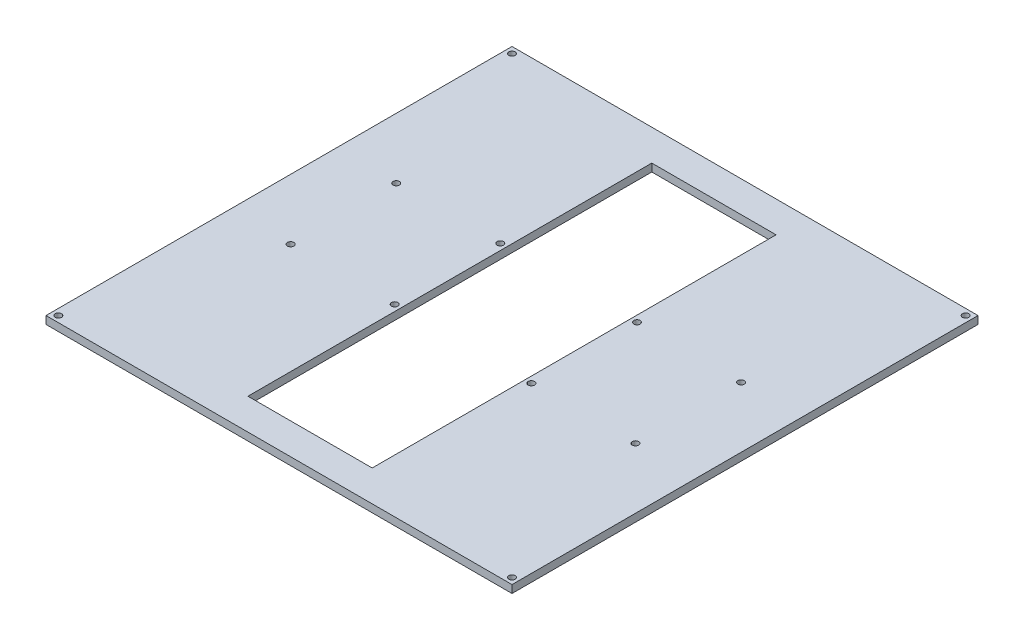
ISO-10303-21;
HEADER;
FILE_DESCRIPTION(('STEP AP214'),'2;1');
FILE_NAME('part.step','',(''),(''),'','','');
FILE_SCHEMA(('AUTOMOTIVE_DESIGN { 1 0 10303 214 1 1 1 1 }'));
ENDSEC;
DATA;
#1=APPLICATION_CONTEXT('core data for automotive mechanical design processes');
#2=APPLICATION_PROTOCOL_DEFINITION('international standard','automotive_design',2000,#1);
#3=PRODUCT_CONTEXT('',#1,'mechanical');
#4=PRODUCT('Part','Part','',(#3));
#5=PRODUCT_RELATED_PRODUCT_CATEGORY('part','',(#4));
#6=PRODUCT_DEFINITION_FORMATION('','',#4);
#7=PRODUCT_DEFINITION_CONTEXT('part definition',#1,'design');
#8=PRODUCT_DEFINITION('design','',#6,#7);
#9=PRODUCT_DEFINITION_SHAPE('','',#8);
#10=(LENGTH_UNIT() NAMED_UNIT(*) SI_UNIT(.MILLI.,.METRE.));
#11=(NAMED_UNIT(*) PLANE_ANGLE_UNIT() SI_UNIT($,.RADIAN.));
#12=(NAMED_UNIT(*) SI_UNIT($,.STERADIAN.) SOLID_ANGLE_UNIT());
#13=UNCERTAINTY_MEASURE_WITH_UNIT(LENGTH_MEASURE(1.E-05),#10,'distance_accuracy_value','');
#14=(GEOMETRIC_REPRESENTATION_CONTEXT(3) GLOBAL_UNCERTAINTY_ASSIGNED_CONTEXT((#13)) GLOBAL_UNIT_ASSIGNED_CONTEXT((#10,
#11,#12)) REPRESENTATION_CONTEXT('',''));
#15=CARTESIAN_POINT('',(0.,0.,0.));
#16=DIRECTION('',(0.,0.,1.));
#17=DIRECTION('',(1.,0.,0.));
#18=AXIS2_PLACEMENT_3D('',#15,#16,#17);
#19=CARTESIAN_POINT('',(-150.,5.,150.));
#20=DIRECTION('',(1.,0.,0.));
#21=DIRECTION('',(0.,0.,-1.));
#22=AXIS2_PLACEMENT_3D('',#19,#20,#21);
#23=PLANE('',#22);
#24=DIRECTION('',(0.,0.,1.));
#25=VECTOR('',#24,1.);
#26=CARTESIAN_POINT('',(-150.,0.,150.));
#27=LINE('',#26,#25);
#28=CARTESIAN_POINT('',(-150.,0.,-150.));
#29=VERTEX_POINT('',#28);
#30=CARTESIAN_POINT('',(-150.,0.,150.));
#31=VERTEX_POINT('',#30);
#32=EDGE_CURVE('E187',#29,#31,#27,.T.);
#33=ORIENTED_EDGE('',*,*,#32,.T.);
#34=DIRECTION('',(0.,-1.,0.));
#35=VECTOR('',#34,1.);
#36=CARTESIAN_POINT('',(-150.,5.,150.));
#37=LINE('',#36,#35);
#38=CARTESIAN_POINT('',(-150.,5.,150.));
#39=VERTEX_POINT('',#38);
#40=EDGE_CURVE('E11',#39,#31,#37,.T.);
#41=ORIENTED_EDGE('',*,*,#40,.F.);
#42=DIRECTION('',(0.,0.,1.));
#43=VECTOR('',#42,1.);
#44=CARTESIAN_POINT('',(-150.,5.,150.));
#45=LINE('',#44,#43);
#46=CARTESIAN_POINT('',(-150.,5.,-150.));
#47=VERTEX_POINT('',#46);
#48=EDGE_CURVE('E188',#47,#39,#45,.T.);
#49=ORIENTED_EDGE('',*,*,#48,.F.);
#50=DIRECTION('',(0.,-1.,0.));
#51=VECTOR('',#50,1.);
#52=CARTESIAN_POINT('',(-150.,5.,-150.));
#53=LINE('',#52,#51);
#54=EDGE_CURVE('E202',#47,#29,#53,.T.);
#55=ORIENTED_EDGE('',*,*,#54,.T.);
#56=EDGE_LOOP('',(#33,#41,#49,#55));
#57=FACE_BOUND('',#56,.T.);
#58=ADVANCED_FACE('F43',(#57),#23,.F.);
#59=CARTESIAN_POINT('',(150.,5.,150.));
#60=DIRECTION('',(0.,0.,-1.));
#61=DIRECTION('',(-1.,0.,0.));
#62=AXIS2_PLACEMENT_3D('',#59,#60,#61);
#63=PLANE('',#62);
#64=DIRECTION('',(1.,0.,0.));
#65=VECTOR('',#64,1.);
#66=CARTESIAN_POINT('',(150.,0.,150.));
#67=LINE('',#66,#65);
#68=CARTESIAN_POINT('',(150.,0.,150.));
#69=VERTEX_POINT('',#68);
#70=EDGE_CURVE('E206',#31,#69,#67,.T.);
#71=ORIENTED_EDGE('',*,*,#70,.T.);
#72=DIRECTION('',(0.,-1.,0.));
#73=VECTOR('',#72,1.);
#74=CARTESIAN_POINT('',(150.,5.,150.));
#75=LINE('',#74,#73);
#76=CARTESIAN_POINT('',(150.,5.,150.));
#77=VERTEX_POINT('',#76);
#78=EDGE_CURVE('E51',#77,#69,#75,.T.);
#79=ORIENTED_EDGE('',*,*,#78,.F.);
#80=DIRECTION('',(1.,0.,0.));
#81=VECTOR('',#80,1.);
#82=CARTESIAN_POINT('',(150.,5.,150.));
#83=LINE('',#82,#81);
#84=EDGE_CURVE('E192',#39,#77,#83,.T.);
#85=ORIENTED_EDGE('',*,*,#84,.F.);
#86=ORIENTED_EDGE('',*,*,#40,.T.);
#87=EDGE_LOOP('',(#71,#79,#85,#86));
#88=FACE_BOUND('',#87,.T.);
#89=ADVANCED_FACE('F241',(#88),#63,.F.);
#90=CARTESIAN_POINT('',(150.,5.,150.));
#91=DIRECTION('',(-1.,0.,0.));
#92=DIRECTION('',(0.,0.,1.));
#93=AXIS2_PLACEMENT_3D('',#90,#91,#92);
#94=PLANE('',#93);
#95=DIRECTION('',(0.,0.,-1.));
#96=VECTOR('',#95,1.);
#97=CARTESIAN_POINT('',(150.,0.,150.));
#98=LINE('',#97,#96);
#99=CARTESIAN_POINT('',(150.,0.,-150.));
#100=VERTEX_POINT('',#99);
#101=EDGE_CURVE('E209',#69,#100,#98,.T.);
#102=ORIENTED_EDGE('',*,*,#101,.T.);
#103=DIRECTION('',(0.,-1.,0.));
#104=VECTOR('',#103,1.);
#105=CARTESIAN_POINT('',(150.,5.,-150.));
#106=LINE('',#105,#104);
#107=CARTESIAN_POINT('',(150.,5.,-150.));
#108=VERTEX_POINT('',#107);
#109=EDGE_CURVE('E217',#108,#100,#106,.T.);
#110=ORIENTED_EDGE('',*,*,#109,.F.);
#111=DIRECTION('',(0.,0.,-1.));
#112=VECTOR('',#111,1.);
#113=CARTESIAN_POINT('',(150.,5.,150.));
#114=LINE('',#113,#112);
#115=EDGE_CURVE('E196',#77,#108,#114,.T.);
#116=ORIENTED_EDGE('',*,*,#115,.F.);
#117=ORIENTED_EDGE('',*,*,#78,.T.);
#118=EDGE_LOOP('',(#102,#110,#116,#117));
#119=FACE_BOUND('',#118,.T.);
#120=ADVANCED_FACE('F226',(#119),#94,.F.);
#121=CARTESIAN_POINT('',(150.,5.,-150.));
#122=DIRECTION('',(0.,0.,1.));
#123=DIRECTION('',(1.,0.,0.));
#124=AXIS2_PLACEMENT_3D('',#121,#122,#123);
#125=PLANE('',#124);
#126=DIRECTION('',(-1.,0.,0.));
#127=VECTOR('',#126,1.);
#128=CARTESIAN_POINT('',(150.,0.,-150.));
#129=LINE('',#128,#127);
#130=EDGE_CURVE('E193',#100,#29,#129,.T.);
#131=ORIENTED_EDGE('',*,*,#130,.T.);
#132=ORIENTED_EDGE('',*,*,#54,.F.);
#133=DIRECTION('',(-1.,0.,0.));
#134=VECTOR('',#133,1.);
#135=CARTESIAN_POINT('',(150.,5.,-150.));
#136=LINE('',#135,#134);
#137=EDGE_CURVE('E199',#108,#47,#136,.T.);
#138=ORIENTED_EDGE('',*,*,#137,.F.);
#139=ORIENTED_EDGE('',*,*,#109,.T.);
#140=EDGE_LOOP('',(#131,#132,#138,#139));
#141=FACE_BOUND('',#140,.T.);
#142=ADVANCED_FACE('F234',(#141),#125,.F.);
#143=CARTESIAN_POINT('',(0.,5.,0.));
#144=DIRECTION('',(0.,1.,0.));
#145=DIRECTION('',(0.,0.,1.));
#146=AXIS2_PLACEMENT_3D('',#143,#144,#145);
#147=PLANE('',#146);
#148=CARTESIAN_POINT('',(111.,5.,31.5314871498272));
#149=DIRECTION('',(0.,-1.,0.));
#150=DIRECTION('',(0.,0.,1.));
#151=AXIS2_PLACEMENT_3D('',#148,#149,#150);
#152=CIRCLE('',#151,2.04999999999999);
#153=CARTESIAN_POINT('',(111.,5.,33.5814871498272));
#154=VERTEX_POINT('',#153);
#155=EDGE_CURVE('E339',#154,#154,#152,.T.);
#156=ORIENTED_EDGE('',*,*,#155,.T.);
#157=EDGE_LOOP('',(#156));
#158=FACE_BOUND('',#157,.T.);
#159=CARTESIAN_POINT('',(44.,5.,31.5314871498272));
#160=DIRECTION('',(0.,-1.,0.));
#161=DIRECTION('',(0.,0.,1.));
#162=AXIS2_PLACEMENT_3D('',#159,#160,#161);
#163=CIRCLE('',#162,2.04999999999999);
#164=CARTESIAN_POINT('',(44.,5.,33.5814871498272));
#165=VERTEX_POINT('',#164);
#166=EDGE_CURVE('E326',#165,#165,#163,.T.);
#167=ORIENTED_EDGE('',*,*,#166,.T.);
#168=EDGE_LOOP('',(#167));
#169=FACE_BOUND('',#168,.T.);
#170=CARTESIAN_POINT('',(44.,5.,-36.4685128501728));
#171=DIRECTION('',(0.,-1.,0.));
#172=DIRECTION('',(0.,0.,1.));
#173=AXIS2_PLACEMENT_3D('',#170,#171,#172);
#174=CIRCLE('',#173,2.04999999999999);
#175=CARTESIAN_POINT('',(44.,5.,-34.4185128501729));
#176=VERTEX_POINT('',#175);
#177=EDGE_CURVE('E320',#176,#176,#174,.T.);
#178=ORIENTED_EDGE('',*,*,#177,.T.);
#179=EDGE_LOOP('',(#178));
#180=FACE_BOUND('',#179,.T.);
#181=CARTESIAN_POINT('',(111.,5.,-36.4685128501728));
#182=DIRECTION('',(0.,-1.,0.));
#183=DIRECTION('',(0.,0.,1.));
#184=AXIS2_PLACEMENT_3D('',#181,#182,#183);
#185=CIRCLE('',#184,2.04999999999999);
#186=CARTESIAN_POINT('',(111.,5.,-34.4185128501728));
#187=VERTEX_POINT('',#186);
#188=EDGE_CURVE('E347',#187,#187,#185,.T.);
#189=ORIENTED_EDGE('',*,*,#188,.T.);
#190=EDGE_LOOP('',(#189));
#191=FACE_BOUND('',#190,.T.);
#192=CARTESIAN_POINT('',(-111.,5.,31.5314871498272));
#193=DIRECTION('',(0.,1.,0.));
#194=DIRECTION('',(0.,0.,1.));
#195=AXIS2_PLACEMENT_3D('',#192,#193,#194);
#196=CIRCLE('',#195,2.04999999999999);
#197=CARTESIAN_POINT('',(-111.,5.,33.5814871498272));
#198=VERTEX_POINT('',#197);
#199=EDGE_CURVE('E369',#198,#198,#196,.T.);
#200=ORIENTED_EDGE('',*,*,#199,.F.);
#201=EDGE_LOOP('',(#200));
#202=FACE_BOUND('',#201,.T.);
#203=CARTESIAN_POINT('',(-44.,5.,31.5314871498272));
#204=DIRECTION('',(0.,1.,0.));
#205=DIRECTION('',(0.,0.,1.));
#206=AXIS2_PLACEMENT_3D('',#203,#204,#205);
#207=CIRCLE('',#206,2.04999999999999);
#208=CARTESIAN_POINT('',(-44.,5.,33.5814871498272));
#209=VERTEX_POINT('',#208);
#210=EDGE_CURVE('E360',#209,#209,#207,.T.);
#211=ORIENTED_EDGE('',*,*,#210,.F.);
#212=EDGE_LOOP('',(#211));
#213=FACE_BOUND('',#212,.T.);
#214=CARTESIAN_POINT('',(-44.,5.,-36.4685128501728));
#215=DIRECTION('',(0.,1.,0.));
#216=DIRECTION('',(0.,0.,1.));
#217=AXIS2_PLACEMENT_3D('',#214,#215,#216);
#218=CIRCLE('',#217,2.04999999999999);
#219=CARTESIAN_POINT('',(-44.,5.,-34.4185128501729));
#220=VERTEX_POINT('',#219);
#221=EDGE_CURVE('E359',#220,#220,#218,.T.);
#222=ORIENTED_EDGE('',*,*,#221,.F.);
#223=EDGE_LOOP('',(#222));
#224=FACE_BOUND('',#223,.T.);
#225=CARTESIAN_POINT('',(-111.,5.,-36.4685128501728));
#226=DIRECTION('',(0.,1.,0.));
#227=DIRECTION('',(0.,0.,1.));
#228=AXIS2_PLACEMENT_3D('',#225,#226,#227);
#229=CIRCLE('',#228,2.04999999999999);
#230=CARTESIAN_POINT('',(-111.,5.,-34.4185128501728));
#231=VERTEX_POINT('',#230);
#232=EDGE_CURVE('E364',#231,#231,#229,.T.);
#233=ORIENTED_EDGE('',*,*,#232,.F.);
#234=EDGE_LOOP('',(#233));
#235=FACE_BOUND('',#234,.T.);
#236=DIRECTION('',(0.,0.,1.));
#237=VECTOR('',#236,1.);
#238=CARTESIAN_POINT('',(-40.,5.,130.));
#239=LINE('',#238,#237);
#240=CARTESIAN_POINT('',(-40.,5.,-130.));
#241=VERTEX_POINT('',#240);
#242=CARTESIAN_POINT('',(-40.,5.,130.));
#243=VERTEX_POINT('',#242);
#244=EDGE_CURVE('E58',#241,#243,#239,.T.);
#245=ORIENTED_EDGE('',*,*,#244,.F.);
#246=DIRECTION('',(-1.,0.,0.));
#247=VECTOR('',#246,1.);
#248=CARTESIAN_POINT('',(40.,5.,-130.));
#249=LINE('',#248,#247);
#250=CARTESIAN_POINT('',(40.,5.,-130.));
#251=VERTEX_POINT('',#250);
#252=EDGE_CURVE('E117',#251,#241,#249,.T.);
#253=ORIENTED_EDGE('',*,*,#252,.F.);
#254=DIRECTION('',(0.,0.,-1.));
#255=VECTOR('',#254,1.);
#256=CARTESIAN_POINT('',(40.,5.,130.));
#257=LINE('',#256,#255);
#258=CARTESIAN_POINT('',(40.,5.,130.));
#259=VERTEX_POINT('',#258);
#260=EDGE_CURVE('E142',#259,#251,#257,.T.);
#261=ORIENTED_EDGE('',*,*,#260,.F.);
#262=DIRECTION('',(1.,0.,0.));
#263=VECTOR('',#262,1.);
#264=CARTESIAN_POINT('',(40.,5.,130.));
#265=LINE('',#264,#263);
#266=EDGE_CURVE('E135',#243,#259,#265,.T.);
#267=ORIENTED_EDGE('',*,*,#266,.F.);
#268=EDGE_LOOP('',(#245,#253,#261,#267));
#269=FACE_BOUND('',#268,.T.);
#270=CARTESIAN_POINT('',(146.,5.,146.));
#271=DIRECTION('',(0.,1.,0.));
#272=DIRECTION('',(0.,0.,-1.));
#273=AXIS2_PLACEMENT_3D('',#270,#271,#272);
#274=CIRCLE('',#273,2.04999999999999);
#275=CARTESIAN_POINT('',(146.,5.,143.95));
#276=VERTEX_POINT('',#275);
#277=EDGE_CURVE('E124',#276,#276,#274,.T.);
#278=ORIENTED_EDGE('',*,*,#277,.F.);
#279=EDGE_LOOP('',(#278));
#280=FACE_BOUND('',#279,.T.);
#281=CARTESIAN_POINT('',(146.,5.,-146.));
#282=DIRECTION('',(0.,-1.,0.));
#283=DIRECTION('',(0.,0.,1.));
#284=AXIS2_PLACEMENT_3D('',#281,#282,#283);
#285=CIRCLE('',#284,2.04999999999999);
#286=CARTESIAN_POINT('',(146.,5.,-143.95));
#287=VERTEX_POINT('',#286);
#288=EDGE_CURVE('E164',#287,#287,#285,.T.);
#289=ORIENTED_EDGE('',*,*,#288,.T.);
#290=EDGE_LOOP('',(#289));
#291=FACE_BOUND('',#290,.T.);
#292=CARTESIAN_POINT('',(-146.,5.,146.));
#293=DIRECTION('',(0.,-1.,0.));
#294=DIRECTION('',(0.,0.,-1.));
#295=AXIS2_PLACEMENT_3D('',#292,#293,#294);
#296=CIRCLE('',#295,2.04999999999999);
#297=CARTESIAN_POINT('',(-146.,5.,143.95));
#298=VERTEX_POINT('',#297);
#299=EDGE_CURVE('E172',#298,#298,#296,.T.);
#300=ORIENTED_EDGE('',*,*,#299,.T.);
#301=EDGE_LOOP('',(#300));
#302=FACE_BOUND('',#301,.T.);
#303=CARTESIAN_POINT('',(-146.,5.,-146.));
#304=DIRECTION('',(0.,1.,0.));
#305=DIRECTION('',(0.,0.,1.));
#306=AXIS2_PLACEMENT_3D('',#303,#304,#305);
#307=CIRCLE('',#306,2.04999999999999);
#308=CARTESIAN_POINT('',(-146.,5.,-143.95));
#309=VERTEX_POINT('',#308);
#310=EDGE_CURVE('E176',#309,#309,#307,.T.);
#311=ORIENTED_EDGE('',*,*,#310,.F.);
#312=EDGE_LOOP('',(#311));
#313=FACE_BOUND('',#312,.T.);
#314=ORIENTED_EDGE('',*,*,#48,.T.);
#315=ORIENTED_EDGE('',*,*,#84,.T.);
#316=ORIENTED_EDGE('',*,*,#115,.T.);
#317=ORIENTED_EDGE('',*,*,#137,.T.);
#318=EDGE_LOOP('',(#314,#315,#316,#317));
#319=FACE_BOUND('',#318,.T.);
#320=ADVANCED_FACE('F240',(#158,#169,#180,#191,#202,#213,#224,#235,#269,#280,#291,#302,#313,
#319),#147,.T.);
#321=CARTESIAN_POINT('',(0.,0.,0.));
#322=DIRECTION('',(0.,1.,0.));
#323=DIRECTION('',(0.,0.,1.));
#324=AXIS2_PLACEMENT_3D('',#321,#322,#323);
#325=PLANE('',#324);
#326=CARTESIAN_POINT('',(111.,0.,31.5314871498272));
#327=DIRECTION('',(0.,1.,0.));
#328=DIRECTION('',(0.,0.,1.));
#329=AXIS2_PLACEMENT_3D('',#326,#327,#328);
#330=CIRCLE('',#329,2.04999999999999);
#331=CARTESIAN_POINT('',(111.,0.,33.5814871498272));
#332=VERTEX_POINT('',#331);
#333=EDGE_CURVE('E343',#332,#332,#330,.T.);
#334=ORIENTED_EDGE('',*,*,#333,.T.);
#335=EDGE_LOOP('',(#334));
#336=FACE_BOUND('',#335,.T.);
#337=CARTESIAN_POINT('',(44.,0.,31.5314871498272));
#338=DIRECTION('',(0.,1.,0.));
#339=DIRECTION('',(0.,0.,1.));
#340=AXIS2_PLACEMENT_3D('',#337,#338,#339);
#341=CIRCLE('',#340,2.04999999999999);
#342=CARTESIAN_POINT('',(44.,0.,33.5814871498272));
#343=VERTEX_POINT('',#342);
#344=EDGE_CURVE('E333',#343,#343,#341,.T.);
#345=ORIENTED_EDGE('',*,*,#344,.T.);
#346=EDGE_LOOP('',(#345));
#347=FACE_BOUND('',#346,.T.);
#348=CARTESIAN_POINT('',(44.,0.,-36.4685128501728));
#349=DIRECTION('',(0.,1.,0.));
#350=DIRECTION('',(0.,0.,1.));
#351=AXIS2_PLACEMENT_3D('',#348,#349,#350);
#352=CIRCLE('',#351,2.04999999999999);
#353=CARTESIAN_POINT('',(44.,0.,-34.4185128501729));
#354=VERTEX_POINT('',#353);
#355=EDGE_CURVE('E323',#354,#354,#352,.T.);
#356=ORIENTED_EDGE('',*,*,#355,.T.);
#357=EDGE_LOOP('',(#356));
#358=FACE_BOUND('',#357,.T.);
#359=CARTESIAN_POINT('',(111.,0.,-36.4685128501728));
#360=DIRECTION('',(0.,1.,0.));
#361=DIRECTION('',(0.,0.,1.));
#362=AXIS2_PLACEMENT_3D('',#359,#360,#361);
#363=CIRCLE('',#362,2.04999999999999);
#364=CARTESIAN_POINT('',(111.,0.,-34.4185128501728));
#365=VERTEX_POINT('',#364);
#366=EDGE_CURVE('E330',#365,#365,#363,.T.);
#367=ORIENTED_EDGE('',*,*,#366,.T.);
#368=EDGE_LOOP('',(#367));
#369=FACE_BOUND('',#368,.T.);
#370=CARTESIAN_POINT('',(-111.,0.,31.5314871498272));
#371=DIRECTION('',(0.,1.,0.));
#372=DIRECTION('',(0.,0.,1.));
#373=AXIS2_PLACEMENT_3D('',#370,#371,#372);
#374=CIRCLE('',#373,2.04999999999999);
#375=CARTESIAN_POINT('',(-111.,0.,33.5814871498272));
#376=VERTEX_POINT('',#375);
#377=EDGE_CURVE('E351',#376,#376,#374,.F.);
#378=ORIENTED_EDGE('',*,*,#377,.F.);
#379=EDGE_LOOP('',(#378));
#380=FACE_BOUND('',#379,.T.);
#381=CARTESIAN_POINT('',(-44.,0.,31.5314871498272));
#382=DIRECTION('',(0.,1.,0.));
#383=DIRECTION('',(0.,0.,1.));
#384=AXIS2_PLACEMENT_3D('',#381,#382,#383);
#385=CIRCLE('',#384,2.04999999999999);
#386=CARTESIAN_POINT('',(-44.,0.,33.5814871498272));
#387=VERTEX_POINT('',#386);
#388=EDGE_CURVE('E365',#387,#387,#385,.F.);
#389=ORIENTED_EDGE('',*,*,#388,.F.);
#390=EDGE_LOOP('',(#389));
#391=FACE_BOUND('',#390,.T.);
#392=CARTESIAN_POINT('',(-44.,0.,-36.4685128501728));
#393=DIRECTION('',(0.,1.,0.));
#394=DIRECTION('',(0.,0.,1.));
#395=AXIS2_PLACEMENT_3D('',#392,#393,#394);
#396=CIRCLE('',#395,2.04999999999999);
#397=CARTESIAN_POINT('',(-44.,0.,-34.4185128501729));
#398=VERTEX_POINT('',#397);
#399=EDGE_CURVE('E355',#398,#398,#396,.F.);
#400=ORIENTED_EDGE('',*,*,#399,.F.);
#401=EDGE_LOOP('',(#400));
#402=FACE_BOUND('',#401,.T.);
#403=CARTESIAN_POINT('',(-111.,0.,-36.4685128501728));
#404=DIRECTION('',(0.,1.,0.));
#405=DIRECTION('',(0.,0.,1.));
#406=AXIS2_PLACEMENT_3D('',#403,#404,#405);
#407=CIRCLE('',#406,2.04999999999999);
#408=CARTESIAN_POINT('',(-111.,0.,-34.4185128501728));
#409=VERTEX_POINT('',#408);
#410=EDGE_CURVE('E382',#409,#409,#407,.F.);
#411=ORIENTED_EDGE('',*,*,#410,.F.);
#412=EDGE_LOOP('',(#411));
#413=FACE_BOUND('',#412,.T.);
#414=DIRECTION('',(1.,0.,0.));
#415=VECTOR('',#414,1.);
#416=CARTESIAN_POINT('',(40.,0.,-130.));
#417=LINE('',#416,#415);
#418=CARTESIAN_POINT('',(-40.,0.,-130.));
#419=VERTEX_POINT('',#418);
#420=CARTESIAN_POINT('',(40.,0.,-130.));
#421=VERTEX_POINT('',#420);
#422=EDGE_CURVE('E130',#419,#421,#417,.T.);
#423=ORIENTED_EDGE('',*,*,#422,.F.);
#424=DIRECTION('',(0.,0.,-1.));
#425=VECTOR('',#424,1.);
#426=CARTESIAN_POINT('',(-40.,0.,130.));
#427=LINE('',#426,#425);
#428=CARTESIAN_POINT('',(-40.,0.,130.));
#429=VERTEX_POINT('',#428);
#430=EDGE_CURVE('E110',#429,#419,#427,.T.);
#431=ORIENTED_EDGE('',*,*,#430,.F.);
#432=DIRECTION('',(-1.,0.,0.));
#433=VECTOR('',#432,1.);
#434=CARTESIAN_POINT('',(40.,0.,130.));
#435=LINE('',#434,#433);
#436=CARTESIAN_POINT('',(40.,0.,130.));
#437=VERTEX_POINT('',#436);
#438=EDGE_CURVE('E120',#437,#429,#435,.T.);
#439=ORIENTED_EDGE('',*,*,#438,.F.);
#440=DIRECTION('',(0.,0.,1.));
#441=VECTOR('',#440,1.);
#442=CARTESIAN_POINT('',(40.,0.,130.));
#443=LINE('',#442,#441);
#444=EDGE_CURVE('E66',#421,#437,#443,.T.);
#445=ORIENTED_EDGE('',*,*,#444,.F.);
#446=EDGE_LOOP('',(#423,#431,#439,#445));
#447=FACE_BOUND('',#446,.T.);
#448=CARTESIAN_POINT('',(146.,0.,146.));
#449=DIRECTION('',(0.,1.,0.));
#450=DIRECTION('',(0.,0.,1.));
#451=AXIS2_PLACEMENT_3D('',#448,#449,#450);
#452=CIRCLE('',#451,2.04999999999999);
#453=CARTESIAN_POINT('',(146.,0.,148.05));
#454=VERTEX_POINT('',#453);
#455=EDGE_CURVE('E159',#454,#454,#452,.F.);
#456=ORIENTED_EDGE('',*,*,#455,.F.);
#457=EDGE_LOOP('',(#456));
#458=FACE_BOUND('',#457,.T.);
#459=CARTESIAN_POINT('',(146.,0.,-146.));
#460=DIRECTION('',(0.,1.,0.));
#461=DIRECTION('',(0.,0.,1.));
#462=AXIS2_PLACEMENT_3D('',#459,#460,#461);
#463=CIRCLE('',#462,2.04999999999999);
#464=CARTESIAN_POINT('',(146.,0.,-143.95));
#465=VERTEX_POINT('',#464);
#466=EDGE_CURVE('E163',#465,#465,#463,.T.);
#467=ORIENTED_EDGE('',*,*,#466,.T.);
#468=EDGE_LOOP('',(#467));
#469=FACE_BOUND('',#468,.T.);
#470=CARTESIAN_POINT('',(-146.,0.,146.));
#471=DIRECTION('',(0.,1.,0.));
#472=DIRECTION('',(0.,0.,1.));
#473=AXIS2_PLACEMENT_3D('',#470,#471,#472);
#474=CIRCLE('',#473,2.04999999999999);
#475=CARTESIAN_POINT('',(-146.,0.,148.05));
#476=VERTEX_POINT('',#475);
#477=EDGE_CURVE('E168',#476,#476,#474,.T.);
#478=ORIENTED_EDGE('',*,*,#477,.T.);
#479=EDGE_LOOP('',(#478));
#480=FACE_BOUND('',#479,.T.);
#481=CARTESIAN_POINT('',(-146.,0.,-146.));
#482=DIRECTION('',(0.,1.,0.));
#483=DIRECTION('',(0.,0.,1.));
#484=AXIS2_PLACEMENT_3D('',#481,#482,#483);
#485=CIRCLE('',#484,2.04999999999999);
#486=CARTESIAN_POINT('',(-146.,0.,-143.95));
#487=VERTEX_POINT('',#486);
#488=EDGE_CURVE('E183',#487,#487,#485,.F.);
#489=ORIENTED_EDGE('',*,*,#488,.F.);
#490=EDGE_LOOP('',(#489));
#491=FACE_BOUND('',#490,.T.);
#492=ORIENTED_EDGE('',*,*,#32,.F.);
#493=ORIENTED_EDGE('',*,*,#130,.F.);
#494=ORIENTED_EDGE('',*,*,#101,.F.);
#495=ORIENTED_EDGE('',*,*,#70,.F.);
#496=EDGE_LOOP('',(#492,#493,#494,#495));
#497=FACE_BOUND('',#496,.T.);
#498=ADVANCED_FACE('F127',(#336,#347,#358,#369,#380,#391,#402,#413,#447,#458,#469,#480,#491,
#497),#325,.F.);
#499=CARTESIAN_POINT('',(-146.,-0.00100000000000013,-146.));
#500=DIRECTION('',(0.,1.,0.));
#501=DIRECTION('',(0.,0.,1.));
#502=AXIS2_PLACEMENT_3D('',#499,#500,#501);
#503=CYLINDRICAL_SURFACE('',#502,2.04999999999999);
#504=ORIENTED_EDGE('',*,*,#310,.T.);
#505=EDGE_LOOP('',(#504));
#506=FACE_BOUND('',#505,.T.);
#507=ORIENTED_EDGE('',*,*,#488,.T.);
#508=EDGE_LOOP('',(#507));
#509=FACE_BOUND('',#508,.T.);
#510=ADVANCED_FACE('F253',(#506,#509),#503,.F.);
#511=CARTESIAN_POINT('',(-146.,-0.00100000000000013,146.));
#512=DIRECTION('',(0.,1.,0.));
#513=DIRECTION('',(0.,0.,1.));
#514=AXIS2_PLACEMENT_3D('',#511,#512,#513);
#515=CYLINDRICAL_SURFACE('',#514,2.04999999999999);
#516=ORIENTED_EDGE('',*,*,#299,.F.);
#517=EDGE_LOOP('',(#516));
#518=FACE_BOUND('',#517,.T.);
#519=ORIENTED_EDGE('',*,*,#477,.F.);
#520=EDGE_LOOP('',(#519));
#521=FACE_BOUND('',#520,.T.);
#522=ADVANCED_FACE('F260',(#518,#521),#515,.F.);
#523=CARTESIAN_POINT('',(146.,-0.00100000000000013,-146.));
#524=DIRECTION('',(0.,1.,0.));
#525=DIRECTION('',(0.,0.,1.));
#526=AXIS2_PLACEMENT_3D('',#523,#524,#525);
#527=CYLINDRICAL_SURFACE('',#526,2.04999999999999);
#528=ORIENTED_EDGE('',*,*,#288,.F.);
#529=EDGE_LOOP('',(#528));
#530=FACE_BOUND('',#529,.T.);
#531=ORIENTED_EDGE('',*,*,#466,.F.);
#532=EDGE_LOOP('',(#531));
#533=FACE_BOUND('',#532,.T.);
#534=ADVANCED_FACE('F264',(#530,#533),#527,.F.);
#535=CARTESIAN_POINT('',(146.,-0.00100000000000013,146.));
#536=DIRECTION('',(0.,1.,0.));
#537=DIRECTION('',(0.,0.,1.));
#538=AXIS2_PLACEMENT_3D('',#535,#536,#537);
#539=CYLINDRICAL_SURFACE('',#538,2.04999999999999);
#540=ORIENTED_EDGE('',*,*,#277,.T.);
#541=EDGE_LOOP('',(#540));
#542=FACE_BOUND('',#541,.T.);
#543=ORIENTED_EDGE('',*,*,#455,.T.);
#544=EDGE_LOOP('',(#543));
#545=FACE_BOUND('',#544,.T.);
#546=ADVANCED_FACE('F268',(#542,#545),#539,.F.);
#547=CARTESIAN_POINT('',(-40.,-0.00100000000000013,130.));
#548=DIRECTION('',(-1.,0.,0.));
#549=DIRECTION('',(0.,0.,1.));
#550=AXIS2_PLACEMENT_3D('',#547,#548,#549);
#551=PLANE('',#550);
#552=ORIENTED_EDGE('',*,*,#430,.T.);
#553=DIRECTION('',(0.,1.,0.));
#554=VECTOR('',#553,1.);
#555=CARTESIAN_POINT('',(-40.,-0.00100000000000013,-130.));
#556=LINE('',#555,#554);
#557=EDGE_CURVE('E125',#419,#241,#556,.T.);
#558=ORIENTED_EDGE('',*,*,#557,.T.);
#559=ORIENTED_EDGE('',*,*,#244,.T.);
#560=DIRECTION('',(0.,1.,0.));
#561=VECTOR('',#560,1.);
#562=CARTESIAN_POINT('',(-40.,-0.00100000000000013,130.));
#563=LINE('',#562,#561);
#564=EDGE_CURVE('E106',#429,#243,#563,.T.);
#565=ORIENTED_EDGE('',*,*,#564,.F.);
#566=EDGE_LOOP('',(#552,#558,#559,#565));
#567=FACE_BOUND('',#566,.T.);
#568=ADVANCED_FACE('F108',(#567),#551,.F.);
#569=CARTESIAN_POINT('',(40.,-0.00100000000000013,-130.));
#570=DIRECTION('',(0.,0.,-1.));
#571=DIRECTION('',(-1.,0.,0.));
#572=AXIS2_PLACEMENT_3D('',#569,#570,#571);
#573=PLANE('',#572);
#574=ORIENTED_EDGE('',*,*,#422,.T.);
#575=DIRECTION('',(0.,1.,0.));
#576=VECTOR('',#575,1.);
#577=CARTESIAN_POINT('',(40.,-0.00100000000000013,-130.));
#578=LINE('',#577,#576);
#579=EDGE_CURVE('E151',#421,#251,#578,.T.);
#580=ORIENTED_EDGE('',*,*,#579,.T.);
#581=ORIENTED_EDGE('',*,*,#252,.T.);
#582=ORIENTED_EDGE('',*,*,#557,.F.);
#583=EDGE_LOOP('',(#574,#580,#581,#582));
#584=FACE_BOUND('',#583,.T.);
#585=ADVANCED_FACE('F275',(#584),#573,.F.);
#586=CARTESIAN_POINT('',(40.,-0.00100000000000013,130.));
#587=DIRECTION('',(1.,0.,0.));
#588=DIRECTION('',(0.,0.,-1.));
#589=AXIS2_PLACEMENT_3D('',#586,#587,#588);
#590=PLANE('',#589);
#591=ORIENTED_EDGE('',*,*,#444,.T.);
#592=DIRECTION('',(0.,1.,0.));
#593=VECTOR('',#592,1.);
#594=CARTESIAN_POINT('',(40.,-0.00100000000000013,130.));
#595=LINE('',#594,#593);
#596=EDGE_CURVE('E116',#437,#259,#595,.T.);
#597=ORIENTED_EDGE('',*,*,#596,.T.);
#598=ORIENTED_EDGE('',*,*,#260,.T.);
#599=ORIENTED_EDGE('',*,*,#579,.F.);
#600=EDGE_LOOP('',(#591,#597,#598,#599));
#601=FACE_BOUND('',#600,.T.);
#602=ADVANCED_FACE('F279',(#601),#590,.F.);
#603=CARTESIAN_POINT('',(40.,-0.00100000000000013,130.));
#604=DIRECTION('',(0.,0.,1.));
#605=DIRECTION('',(1.,0.,0.));
#606=AXIS2_PLACEMENT_3D('',#603,#604,#605);
#607=PLANE('',#606);
#608=ORIENTED_EDGE('',*,*,#438,.T.);
#609=ORIENTED_EDGE('',*,*,#564,.T.);
#610=ORIENTED_EDGE('',*,*,#266,.T.);
#611=ORIENTED_EDGE('',*,*,#596,.F.);
#612=EDGE_LOOP('',(#608,#609,#610,#611));
#613=FACE_BOUND('',#612,.T.);
#614=ADVANCED_FACE('F121',(#613),#607,.F.);
#615=CARTESIAN_POINT('',(-111.,-0.00100000000000013,-36.4685128501728));
#616=DIRECTION('',(0.,1.,0.));
#617=DIRECTION('',(0.,0.,1.));
#618=AXIS2_PLACEMENT_3D('',#615,#616,#617);
#619=CYLINDRICAL_SURFACE('',#618,2.04999999999999);
#620=ORIENTED_EDGE('',*,*,#232,.T.);
#621=EDGE_LOOP('',(#620));
#622=FACE_BOUND('',#621,.T.);
#623=ORIENTED_EDGE('',*,*,#410,.T.);
#624=EDGE_LOOP('',(#623));
#625=FACE_BOUND('',#624,.T.);
#626=ADVANCED_FACE('F278',(#622,#625),#619,.F.);
#627=CARTESIAN_POINT('',(-44.,-0.00100000000000013,-36.4685128501728));
#628=DIRECTION('',(0.,1.,0.));
#629=DIRECTION('',(0.,0.,1.));
#630=AXIS2_PLACEMENT_3D('',#627,#628,#629);
#631=CYLINDRICAL_SURFACE('',#630,2.04999999999999);
#632=ORIENTED_EDGE('',*,*,#221,.T.);
#633=EDGE_LOOP('',(#632));
#634=FACE_BOUND('',#633,.T.);
#635=ORIENTED_EDGE('',*,*,#399,.T.);
#636=EDGE_LOOP('',(#635));
#637=FACE_BOUND('',#636,.T.);
#638=ADVANCED_FACE('F287',(#634,#637),#631,.F.);
#639=CARTESIAN_POINT('',(-44.,-0.00100000000000013,31.5314871498272));
#640=DIRECTION('',(0.,1.,0.));
#641=DIRECTION('',(0.,0.,1.));
#642=AXIS2_PLACEMENT_3D('',#639,#640,#641);
#643=CYLINDRICAL_SURFACE('',#642,2.04999999999999);
#644=ORIENTED_EDGE('',*,*,#210,.T.);
#645=EDGE_LOOP('',(#644));
#646=FACE_BOUND('',#645,.T.);
#647=ORIENTED_EDGE('',*,*,#388,.T.);
#648=EDGE_LOOP('',(#647));
#649=FACE_BOUND('',#648,.T.);
#650=ADVANCED_FACE('F293',(#646,#649),#643,.F.);
#651=CARTESIAN_POINT('',(-111.,-0.00100000000000013,31.5314871498272));
#652=DIRECTION('',(0.,1.,0.));
#653=DIRECTION('',(0.,0.,1.));
#654=AXIS2_PLACEMENT_3D('',#651,#652,#653);
#655=CYLINDRICAL_SURFACE('',#654,2.04999999999999);
#656=ORIENTED_EDGE('',*,*,#199,.T.);
#657=EDGE_LOOP('',(#656));
#658=FACE_BOUND('',#657,.T.);
#659=ORIENTED_EDGE('',*,*,#377,.T.);
#660=EDGE_LOOP('',(#659));
#661=FACE_BOUND('',#660,.T.);
#662=ADVANCED_FACE('F289',(#658,#661),#655,.F.);
#663=CARTESIAN_POINT('',(111.,-0.00100000000000013,-36.4685128501728));
#664=DIRECTION('',(0.,1.,0.));
#665=DIRECTION('',(0.,0.,1.));
#666=AXIS2_PLACEMENT_3D('',#663,#664,#665);
#667=CYLINDRICAL_SURFACE('',#666,2.04999999999999);
#668=ORIENTED_EDGE('',*,*,#188,.F.);
#669=EDGE_LOOP('',(#668));
#670=FACE_BOUND('',#669,.T.);
#671=ORIENTED_EDGE('',*,*,#366,.F.);
#672=EDGE_LOOP('',(#671));
#673=FACE_BOUND('',#672,.T.);
#674=ADVANCED_FACE('F292',(#670,#673),#667,.F.);
#675=CARTESIAN_POINT('',(44.,-0.00100000000000013,-36.4685128501728));
#676=DIRECTION('',(0.,1.,0.));
#677=DIRECTION('',(0.,0.,1.));
#678=AXIS2_PLACEMENT_3D('',#675,#676,#677);
#679=CYLINDRICAL_SURFACE('',#678,2.04999999999999);
#680=ORIENTED_EDGE('',*,*,#177,.F.);
#681=EDGE_LOOP('',(#680));
#682=FACE_BOUND('',#681,.T.);
#683=ORIENTED_EDGE('',*,*,#355,.F.);
#684=EDGE_LOOP('',(#683));
#685=FACE_BOUND('',#684,.T.);
#686=ADVANCED_FACE('F303',(#682,#685),#679,.F.);
#687=CARTESIAN_POINT('',(44.,-0.00100000000000013,31.5314871498272));
#688=DIRECTION('',(0.,1.,0.));
#689=DIRECTION('',(0.,0.,1.));
#690=AXIS2_PLACEMENT_3D('',#687,#688,#689);
#691=CYLINDRICAL_SURFACE('',#690,2.04999999999999);
#692=ORIENTED_EDGE('',*,*,#166,.F.);
#693=EDGE_LOOP('',(#692));
#694=FACE_BOUND('',#693,.T.);
#695=ORIENTED_EDGE('',*,*,#344,.F.);
#696=EDGE_LOOP('',(#695));
#697=FACE_BOUND('',#696,.T.);
#698=ADVANCED_FACE('F308',(#694,#697),#691,.F.);
#699=CARTESIAN_POINT('',(111.,-0.00100000000000013,31.5314871498272));
#700=DIRECTION('',(0.,1.,0.));
#701=DIRECTION('',(0.,0.,1.));
#702=AXIS2_PLACEMENT_3D('',#699,#700,#701);
#703=CYLINDRICAL_SURFACE('',#702,2.04999999999999);
#704=ORIENTED_EDGE('',*,*,#155,.F.);
#705=EDGE_LOOP('',(#704));
#706=FACE_BOUND('',#705,.T.);
#707=ORIENTED_EDGE('',*,*,#333,.F.);
#708=EDGE_LOOP('',(#707));
#709=FACE_BOUND('',#708,.T.);
#710=ADVANCED_FACE('F305',(#706,#709),#703,.F.);
#711=CLOSED_SHELL('',(#58,#89,#120,#142,#320,#498,#510,#522,#534,#546,#568,#585,#602,#614,#626,
#638,#650,#662,#674,#686,#698,#710));
#712=MANIFOLD_SOLID_BREP('B2',#711);
#713=ADVANCED_BREP_SHAPE_REPRESENTATION('',(#18,#712),#14);
#714=SHAPE_DEFINITION_REPRESENTATION(#9,#713);
ENDSEC;
END-ISO-10303-21;
